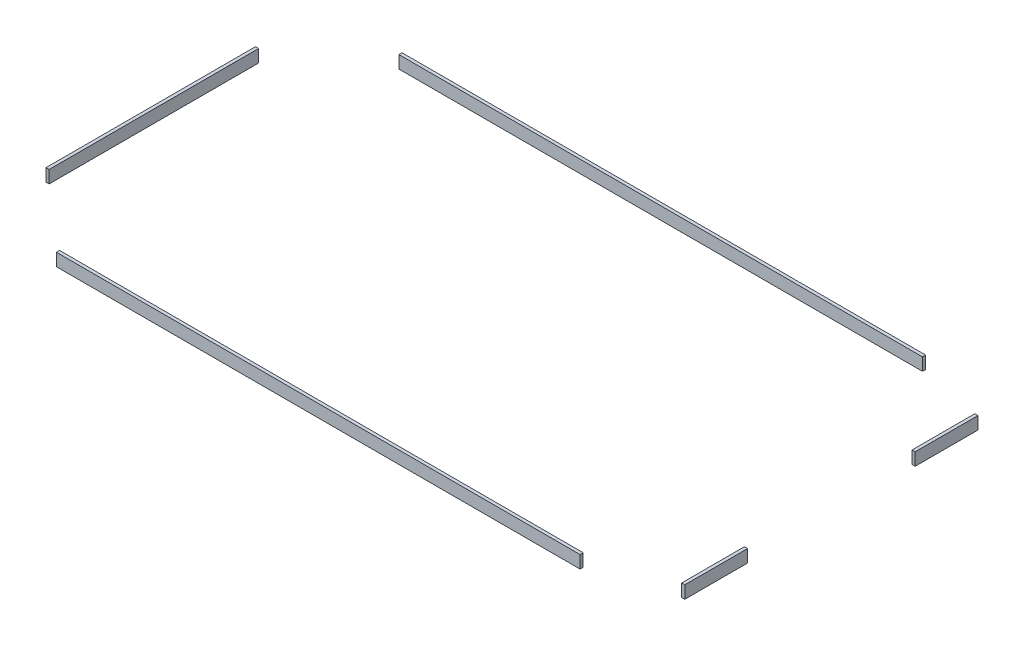
ISO-10303-21;
HEADER;
FILE_DESCRIPTION(('STEP AP214'),'2;1');
FILE_NAME('part.step','',(''),(''),'','','');
FILE_SCHEMA(('AUTOMOTIVE_DESIGN { 1 0 10303 214 1 1 1 1 }'));
ENDSEC;
DATA;
#1=APPLICATION_CONTEXT('core data for automotive mechanical design processes');
#2=APPLICATION_PROTOCOL_DEFINITION('international standard','automotive_design',2000,#1);
#3=PRODUCT_CONTEXT('',#1,'mechanical');
#4=PRODUCT('Part','Part','',(#3));
#5=PRODUCT_RELATED_PRODUCT_CATEGORY('part','',(#4));
#6=PRODUCT_DEFINITION_FORMATION('','',#4);
#7=PRODUCT_DEFINITION_CONTEXT('part definition',#1,'design');
#8=PRODUCT_DEFINITION('design','',#6,#7);
#9=PRODUCT_DEFINITION_SHAPE('','',#8);
#10=(LENGTH_UNIT() NAMED_UNIT(*) SI_UNIT(.MILLI.,.METRE.));
#11=(NAMED_UNIT(*) PLANE_ANGLE_UNIT() SI_UNIT($,.RADIAN.));
#12=(NAMED_UNIT(*) SI_UNIT($,.STERADIAN.) SOLID_ANGLE_UNIT());
#13=UNCERTAINTY_MEASURE_WITH_UNIT(LENGTH_MEASURE(1.E-05),#10,'distance_accuracy_value','');
#14=(GEOMETRIC_REPRESENTATION_CONTEXT(3) GLOBAL_UNCERTAINTY_ASSIGNED_CONTEXT((#13)) GLOBAL_UNIT_ASSIGNED_CONTEXT((#10,
#11,#12)) REPRESENTATION_CONTEXT('',''));
#15=CARTESIAN_POINT('',(0.,0.,0.));
#16=DIRECTION('',(0.,0.,1.));
#17=DIRECTION('',(1.,0.,0.));
#18=AXIS2_PLACEMENT_3D('',#15,#16,#17);
#19=CARTESIAN_POINT('',(162.5,-3.,-81.75));
#20=DIRECTION('',(0.,1.,0.));
#21=DIRECTION('',(-1.,0.,0.));
#22=AXIS2_PLACEMENT_3D('',#19,#20,#21);
#23=PLANE('',#22);
#24=DIRECTION('',(0.,0.,1.));
#25=VECTOR('',#24,1.);
#26=CARTESIAN_POINT('',(161.,-3.,-81.75));
#27=LINE('',#26,#25);
#28=CARTESIAN_POINT('',(161.,-3.,-70.));
#29=VERTEX_POINT('',#28);
#30=CARTESIAN_POINT('',(161.,-3.,-40.));
#31=VERTEX_POINT('',#30);
#32=EDGE_CURVE('E115',#29,#31,#27,.T.);
#33=ORIENTED_EDGE('',*,*,#32,.F.);
#34=DIRECTION('',(1.,0.,0.));
#35=VECTOR('',#34,1.);
#36=CARTESIAN_POINT('',(217.543604288316,-3.,-70.));
#37=LINE('',#36,#35);
#38=CARTESIAN_POINT('',(162.5,-3.,-70.));
#39=VERTEX_POINT('',#38);
#40=EDGE_CURVE('E131',#29,#39,#37,.T.);
#41=ORIENTED_EDGE('',*,*,#40,.T.);
#42=DIRECTION('',(0.,0.,1.));
#43=VECTOR('',#42,1.);
#44=CARTESIAN_POINT('',(162.5,-3.,-81.75));
#45=LINE('',#44,#43);
#46=CARTESIAN_POINT('',(162.5,-3.,-40.));
#47=VERTEX_POINT('',#46);
#48=EDGE_CURVE('E65',#39,#47,#45,.T.);
#49=ORIENTED_EDGE('',*,*,#48,.T.);
#50=DIRECTION('',(-1.,0.,0.));
#51=VECTOR('',#50,1.);
#52=CARTESIAN_POINT('',(127.175720913228,-3.,-40.));
#53=LINE('',#52,#51);
#54=EDGE_CURVE('E126',#47,#31,#53,.T.);
#55=ORIENTED_EDGE('',*,*,#54,.T.);
#56=EDGE_LOOP('',(#33,#41,#49,#55));
#57=FACE_BOUND('',#56,.T.);
#58=ADVANCED_FACE('F62',(#57),#23,.F.);
#59=CARTESIAN_POINT('',(162.5,-3.,-81.75));
#60=DIRECTION('',(-1.,0.,0.));
#61=DIRECTION('',(0.,0.,1.));
#62=AXIS2_PLACEMENT_3D('',#59,#60,#61);
#63=PLANE('',#62);
#64=ORIENTED_EDGE('',*,*,#48,.F.);
#65=DIRECTION('',(0.,1.,0.));
#66=VECTOR('',#65,1.);
#67=CARTESIAN_POINT('',(162.5,-3.,-70.));
#68=LINE('',#67,#66);
#69=CARTESIAN_POINT('',(162.5,3.,-70.));
#70=VERTEX_POINT('',#69);
#71=EDGE_CURVE('E79',#39,#70,#68,.T.);
#72=ORIENTED_EDGE('',*,*,#71,.T.);
#73=DIRECTION('',(0.,0.,1.));
#74=VECTOR('',#73,1.);
#75=CARTESIAN_POINT('',(162.5,3.,-81.75));
#76=LINE('',#75,#74);
#77=CARTESIAN_POINT('',(162.5,3.,-40.));
#78=VERTEX_POINT('',#77);
#79=EDGE_CURVE('E122',#70,#78,#76,.T.);
#80=ORIENTED_EDGE('',*,*,#79,.T.);
#81=DIRECTION('',(0.,-1.,0.));
#82=VECTOR('',#81,1.);
#83=CARTESIAN_POINT('',(162.5,-3.,-40.));
#84=LINE('',#83,#82);
#85=EDGE_CURVE('E102',#78,#47,#84,.T.);
#86=ORIENTED_EDGE('',*,*,#85,.T.);
#87=EDGE_LOOP('',(#64,#72,#80,#86));
#88=FACE_BOUND('',#87,.T.);
#89=ADVANCED_FACE('F134',(#88),#63,.F.);
#90=CARTESIAN_POINT('',(161.,3.,-81.75));
#91=DIRECTION('',(0.,-1.,0.));
#92=DIRECTION('',(0.,0.,-1.));
#93=AXIS2_PLACEMENT_3D('',#90,#91,#92);
#94=PLANE('',#93);
#95=ORIENTED_EDGE('',*,*,#79,.F.);
#96=DIRECTION('',(1.,0.,0.));
#97=VECTOR('',#96,1.);
#98=CARTESIAN_POINT('',(217.543604288316,3.,-70.));
#99=LINE('',#98,#97);
#100=CARTESIAN_POINT('',(161.,3.,-70.));
#101=VERTEX_POINT('',#100);
#102=EDGE_CURVE('E13',#101,#70,#99,.T.);
#103=ORIENTED_EDGE('',*,*,#102,.F.);
#104=DIRECTION('',(0.,0.,1.));
#105=VECTOR('',#104,1.);
#106=CARTESIAN_POINT('',(161.,3.,-81.75));
#107=LINE('',#106,#105);
#108=CARTESIAN_POINT('',(161.,3.,-40.));
#109=VERTEX_POINT('',#108);
#110=EDGE_CURVE('E113',#101,#109,#107,.T.);
#111=ORIENTED_EDGE('',*,*,#110,.T.);
#112=DIRECTION('',(-1.,0.,0.));
#113=VECTOR('',#112,1.);
#114=CARTESIAN_POINT('',(127.175720913228,3.,-40.));
#115=LINE('',#114,#113);
#116=EDGE_CURVE('E71',#78,#109,#115,.T.);
#117=ORIENTED_EDGE('',*,*,#116,.F.);
#118=EDGE_LOOP('',(#95,#103,#111,#117));
#119=FACE_BOUND('',#118,.T.);
#120=ADVANCED_FACE('F118',(#119),#94,.F.);
#121=CARTESIAN_POINT('',(161.,3.,-81.75));
#122=DIRECTION('',(1.,0.,0.));
#123=DIRECTION('',(0.,0.,-1.));
#124=AXIS2_PLACEMENT_3D('',#121,#122,#123);
#125=PLANE('',#124);
#126=ORIENTED_EDGE('',*,*,#110,.F.);
#127=DIRECTION('',(0.,-1.,0.));
#128=VECTOR('',#127,1.);
#129=CARTESIAN_POINT('',(161.,3.,-70.));
#130=LINE('',#129,#128);
#131=EDGE_CURVE('E119',#101,#29,#130,.T.);
#132=ORIENTED_EDGE('',*,*,#131,.T.);
#133=ORIENTED_EDGE('',*,*,#32,.T.);
#134=DIRECTION('',(0.,1.,0.));
#135=VECTOR('',#134,1.);
#136=CARTESIAN_POINT('',(161.,3.,-40.));
#137=LINE('',#136,#135);
#138=EDGE_CURVE('E99',#31,#109,#137,.T.);
#139=ORIENTED_EDGE('',*,*,#138,.T.);
#140=EDGE_LOOP('',(#126,#132,#133,#139));
#141=FACE_BOUND('',#140,.T.);
#142=ADVANCED_FACE('F111',(#141),#125,.F.);
#143=CARTESIAN_POINT('',(127.175720913228,-3.,-40.));
#144=DIRECTION('',(0.,0.,-1.));
#145=DIRECTION('',(-1.,0.,0.));
#146=AXIS2_PLACEMENT_3D('',#143,#144,#145);
#147=PLANE('',#146);
#148=ORIENTED_EDGE('',*,*,#116,.T.);
#149=ORIENTED_EDGE('',*,*,#138,.F.);
#150=ORIENTED_EDGE('',*,*,#54,.F.);
#151=ORIENTED_EDGE('',*,*,#85,.F.);
#152=EDGE_LOOP('',(#148,#149,#150,#151));
#153=FACE_BOUND('',#152,.T.);
#154=ADVANCED_FACE('F98',(#153),#147,.F.);
#155=CARTESIAN_POINT('',(217.543604288316,-3.,-70.));
#156=DIRECTION('',(0.,0.,1.));
#157=DIRECTION('',(1.,0.,0.));
#158=AXIS2_PLACEMENT_3D('',#155,#156,#157);
#159=PLANE('',#158);
#160=ORIENTED_EDGE('',*,*,#40,.F.);
#161=ORIENTED_EDGE('',*,*,#131,.F.);
#162=ORIENTED_EDGE('',*,*,#102,.T.);
#163=ORIENTED_EDGE('',*,*,#71,.F.);
#164=EDGE_LOOP('',(#160,#161,#162,#163));
#165=FACE_BOUND('',#164,.T.);
#166=ADVANCED_FACE('F144',(#165),#159,.F.);
#167=CLOSED_SHELL('',(#58,#89,#120,#142,#154,#166));
#168=MANIFOLD_SOLID_BREP('B2',#167);
#169=CARTESIAN_POINT('',(-161.75,3.,-81.));
#170=DIRECTION('',(0.,0.,-1.));
#171=DIRECTION('',(-1.,0.,0.));
#172=AXIS2_PLACEMENT_3D('',#169,#170,#171);
#173=PLANE('',#172);
#174=DIRECTION('',(1.,0.,0.));
#175=VECTOR('',#174,1.);
#176=CARTESIAN_POINT('',(-161.75,3.,-81.));
#177=LINE('',#176,#175);
#178=CARTESIAN_POINT('',(-125.,3.,-80.9999999999998));
#179=VERTEX_POINT('',#178);
#180=CARTESIAN_POINT('',(125.,3.,-80.9999999999998));
#181=VERTEX_POINT('',#180);
#182=EDGE_CURVE('E260',#179,#181,#177,.T.);
#183=ORIENTED_EDGE('',*,*,#182,.F.);
#184=DIRECTION('',(0.,-1.,0.));
#185=VECTOR('',#184,1.);
#186=CARTESIAN_POINT('',(-125.,3.,-81.));
#187=LINE('',#186,#185);
#188=CARTESIAN_POINT('',(-125.,-3.,-80.9999999999998));
#189=VERTEX_POINT('',#188);
#190=EDGE_CURVE('E265',#179,#189,#187,.T.);
#191=ORIENTED_EDGE('',*,*,#190,.T.);
#192=DIRECTION('',(1.,0.,0.));
#193=VECTOR('',#192,1.);
#194=CARTESIAN_POINT('',(-161.75,-3.,-81.));
#195=LINE('',#194,#193);
#196=CARTESIAN_POINT('',(125.,-3.,-81.));
#197=VERTEX_POINT('',#196);
#198=EDGE_CURVE('E207',#189,#197,#195,.T.);
#199=ORIENTED_EDGE('',*,*,#198,.T.);
#200=DIRECTION('',(0.,1.,0.));
#201=VECTOR('',#200,1.);
#202=CARTESIAN_POINT('',(125.,3.,-81.));
#203=LINE('',#202,#201);
#204=EDGE_CURVE('E228',#197,#181,#203,.T.);
#205=ORIENTED_EDGE('',*,*,#204,.T.);
#206=EDGE_LOOP('',(#183,#191,#199,#205));
#207=FACE_BOUND('',#206,.T.);
#208=ADVANCED_FACE('F204',(#207),#173,.F.);
#209=CARTESIAN_POINT('',(-161.75,3.,-81.));
#210=DIRECTION('',(0.,-1.,0.));
#211=DIRECTION('',(0.,0.,-1.));
#212=AXIS2_PLACEMENT_3D('',#209,#210,#211);
#213=PLANE('',#212);
#214=DIRECTION('',(1.,0.,0.));
#215=VECTOR('',#214,1.);
#216=CARTESIAN_POINT('',(-161.75,3.,-82.5));
#217=LINE('',#216,#215);
#218=CARTESIAN_POINT('',(-125.,3.,-82.5));
#219=VERTEX_POINT('',#218);
#220=CARTESIAN_POINT('',(125.,3.,-82.5));
#221=VERTEX_POINT('',#220);
#222=EDGE_CURVE('E212',#219,#221,#217,.T.);
#223=ORIENTED_EDGE('',*,*,#222,.F.);
#224=DIRECTION('',(0.,0.,-1.));
#225=VECTOR('',#224,1.);
#226=CARTESIAN_POINT('',(-125.,3.,-90.));
#227=LINE('',#226,#225);
#228=EDGE_CURVE('E270',#179,#219,#227,.T.);
#229=ORIENTED_EDGE('',*,*,#228,.F.);
#230=ORIENTED_EDGE('',*,*,#182,.T.);
#231=DIRECTION('',(0.,0.,1.));
#232=VECTOR('',#231,1.);
#233=CARTESIAN_POINT('',(125.,3.,-100.493794054243));
#234=LINE('',#233,#232);
#235=EDGE_CURVE('E247',#221,#181,#234,.T.);
#236=ORIENTED_EDGE('',*,*,#235,.F.);
#237=EDGE_LOOP('',(#223,#229,#230,#236));
#238=FACE_BOUND('',#237,.T.);
#239=ADVANCED_FACE('F257',(#238),#213,.F.);
#240=CARTESIAN_POINT('',(-161.75,-3.,-82.5));
#241=DIRECTION('',(0.,0.,1.));
#242=DIRECTION('',(1.,0.,0.));
#243=AXIS2_PLACEMENT_3D('',#240,#241,#242);
#244=PLANE('',#243);
#245=DIRECTION('',(1.,0.,0.));
#246=VECTOR('',#245,1.);
#247=CARTESIAN_POINT('',(-161.75,-3.,-82.5));
#248=LINE('',#247,#246);
#249=CARTESIAN_POINT('',(-125.,-3.,-82.5));
#250=VERTEX_POINT('',#249);
#251=CARTESIAN_POINT('',(125.,-3.,-82.5));
#252=VERTEX_POINT('',#251);
#253=EDGE_CURVE('E60',#250,#252,#248,.T.);
#254=ORIENTED_EDGE('',*,*,#253,.F.);
#255=DIRECTION('',(0.,1.,0.));
#256=VECTOR('',#255,1.);
#257=CARTESIAN_POINT('',(-125.,-3.,-82.5));
#258=LINE('',#257,#256);
#259=EDGE_CURVE('E220',#250,#219,#258,.T.);
#260=ORIENTED_EDGE('',*,*,#259,.T.);
#261=ORIENTED_EDGE('',*,*,#222,.T.);
#262=DIRECTION('',(0.,-1.,0.));
#263=VECTOR('',#262,1.);
#264=CARTESIAN_POINT('',(125.,-3.,-82.5));
#265=LINE('',#264,#263);
#266=EDGE_CURVE('E244',#221,#252,#265,.T.);
#267=ORIENTED_EDGE('',*,*,#266,.T.);
#268=EDGE_LOOP('',(#254,#260,#261,#267));
#269=FACE_BOUND('',#268,.T.);
#270=ADVANCED_FACE('F262',(#269),#244,.F.);
#271=CARTESIAN_POINT('',(-161.75,-3.,-82.5));
#272=DIRECTION('',(0.,1.,0.));
#273=DIRECTION('',(0.,0.,1.));
#274=AXIS2_PLACEMENT_3D('',#271,#272,#273);
#275=PLANE('',#274);
#276=ORIENTED_EDGE('',*,*,#198,.F.);
#277=DIRECTION('',(0.,0.,-1.));
#278=VECTOR('',#277,1.);
#279=CARTESIAN_POINT('',(-125.,-3.,-90.));
#280=LINE('',#279,#278);
#281=EDGE_CURVE('E252',#189,#250,#280,.T.);
#282=ORIENTED_EDGE('',*,*,#281,.T.);
#283=ORIENTED_EDGE('',*,*,#253,.T.);
#284=DIRECTION('',(0.,0.,1.));
#285=VECTOR('',#284,1.);
#286=CARTESIAN_POINT('',(125.,-3.,-100.493794054243));
#287=LINE('',#286,#285);
#288=EDGE_CURVE('E248',#252,#197,#287,.T.);
#289=ORIENTED_EDGE('',*,*,#288,.T.);
#290=EDGE_LOOP('',(#276,#282,#283,#289));
#291=FACE_BOUND('',#290,.T.);
#292=ADVANCED_FACE('F278',(#291),#275,.F.);
#293=CARTESIAN_POINT('',(125.,-3.,-100.493794054243));
#294=DIRECTION('',(-1.,0.,0.));
#295=DIRECTION('',(0.,0.,1.));
#296=AXIS2_PLACEMENT_3D('',#293,#294,#295);
#297=PLANE('',#296);
#298=ORIENTED_EDGE('',*,*,#288,.F.);
#299=ORIENTED_EDGE('',*,*,#266,.F.);
#300=ORIENTED_EDGE('',*,*,#235,.T.);
#301=ORIENTED_EDGE('',*,*,#204,.F.);
#302=EDGE_LOOP('',(#298,#299,#300,#301));
#303=FACE_BOUND('',#302,.T.);
#304=ADVANCED_FACE('F246',(#303),#297,.F.);
#305=CARTESIAN_POINT('',(-125.,-3.,-90.));
#306=DIRECTION('',(1.,0.,0.));
#307=DIRECTION('',(0.,0.,-1.));
#308=AXIS2_PLACEMENT_3D('',#305,#306,#307);
#309=PLANE('',#308);
#310=ORIENTED_EDGE('',*,*,#228,.T.);
#311=ORIENTED_EDGE('',*,*,#259,.F.);
#312=ORIENTED_EDGE('',*,*,#281,.F.);
#313=ORIENTED_EDGE('',*,*,#190,.F.);
#314=EDGE_LOOP('',(#310,#311,#312,#313));
#315=FACE_BOUND('',#314,.T.);
#316=ADVANCED_FACE('F273',(#315),#309,.F.);
#317=CLOSED_SHELL('',(#208,#239,#270,#292,#304,#316));
#318=MANIFOLD_SOLID_BREP('B7',#317);
#319=CARTESIAN_POINT('',(161.,3.,-81.75));
#320=DIRECTION('',(1.,0.,0.));
#321=DIRECTION('',(0.,0.,-1.));
#322=AXIS2_PLACEMENT_3D('',#319,#320,#321);
#323=PLANE('',#322);
#324=DIRECTION('',(0.,0.,1.));
#325=VECTOR('',#324,1.);
#326=CARTESIAN_POINT('',(161.,3.,-81.75));
#327=LINE('',#326,#325);
#328=CARTESIAN_POINT('',(161.,3.,40.));
#329=VERTEX_POINT('',#328);
#330=CARTESIAN_POINT('',(161.,3.,70.));
#331=VERTEX_POINT('',#330);
#332=EDGE_CURVE('E401',#329,#331,#327,.T.);
#333=ORIENTED_EDGE('',*,*,#332,.F.);
#334=DIRECTION('',(0.,-1.,0.));
#335=VECTOR('',#334,1.);
#336=CARTESIAN_POINT('',(161.,3.,40.));
#337=LINE('',#336,#335);
#338=CARTESIAN_POINT('',(161.,-3.,40.));
#339=VERTEX_POINT('',#338);
#340=EDGE_CURVE('E202',#329,#339,#337,.T.);
#341=ORIENTED_EDGE('',*,*,#340,.T.);
#342=DIRECTION('',(0.,0.,1.));
#343=VECTOR('',#342,1.);
#344=CARTESIAN_POINT('',(161.,-3.,-81.75));
#345=LINE('',#344,#343);
#346=CARTESIAN_POINT('',(161.,-3.,70.));
#347=VERTEX_POINT('',#346);
#348=EDGE_CURVE('E407',#339,#347,#345,.T.);
#349=ORIENTED_EDGE('',*,*,#348,.T.);
#350=DIRECTION('',(0.,1.,0.));
#351=VECTOR('',#350,1.);
#352=CARTESIAN_POINT('',(161.,3.,70.));
#353=LINE('',#352,#351);
#354=EDGE_CURVE('E354',#347,#331,#353,.T.);
#355=ORIENTED_EDGE('',*,*,#354,.T.);
#356=EDGE_LOOP('',(#333,#341,#349,#355));
#357=FACE_BOUND('',#356,.T.);
#358=ADVANCED_FACE('F346',(#357),#323,.F.);
#359=CARTESIAN_POINT('',(161.,3.,-81.75));
#360=DIRECTION('',(0.,-1.,0.));
#361=DIRECTION('',(0.,0.,-1.));
#362=AXIS2_PLACEMENT_3D('',#359,#360,#361);
#363=PLANE('',#362);
#364=DIRECTION('',(0.,0.,1.));
#365=VECTOR('',#364,1.);
#366=CARTESIAN_POINT('',(162.5,3.,-81.75));
#367=LINE('',#366,#365);
#368=CARTESIAN_POINT('',(162.5,3.,40.));
#369=VERTEX_POINT('',#368);
#370=CARTESIAN_POINT('',(162.5,3.,70.));
#371=VERTEX_POINT('',#370);
#372=EDGE_CURVE('E399',#369,#371,#367,.T.);
#373=ORIENTED_EDGE('',*,*,#372,.F.);
#374=DIRECTION('',(1.,0.,0.));
#375=VECTOR('',#374,1.);
#376=CARTESIAN_POINT('',(127.175720913228,3.,40.));
#377=LINE('',#376,#375);
#378=EDGE_CURVE('E416',#329,#369,#377,.T.);
#379=ORIENTED_EDGE('',*,*,#378,.F.);
#380=ORIENTED_EDGE('',*,*,#332,.T.);
#381=DIRECTION('',(-1.,0.,0.));
#382=VECTOR('',#381,1.);
#383=CARTESIAN_POINT('',(217.543604288316,3.,70.));
#384=LINE('',#383,#382);
#385=EDGE_CURVE('E361',#371,#331,#384,.T.);
#386=ORIENTED_EDGE('',*,*,#385,.F.);
#387=EDGE_LOOP('',(#373,#379,#380,#386));
#388=FACE_BOUND('',#387,.T.);
#389=ADVANCED_FACE('F397',(#388),#363,.F.);
#390=CARTESIAN_POINT('',(162.5,-3.,-81.75));
#391=DIRECTION('',(-1.,0.,0.));
#392=DIRECTION('',(0.,0.,1.));
#393=AXIS2_PLACEMENT_3D('',#390,#391,#392);
#394=PLANE('',#393);
#395=DIRECTION('',(0.,0.,1.));
#396=VECTOR('',#395,1.);
#397=CARTESIAN_POINT('',(162.5,-3.,-81.75));
#398=LINE('',#397,#396);
#399=CARTESIAN_POINT('',(162.5,-3.,40.));
#400=VERTEX_POINT('',#399);
#401=CARTESIAN_POINT('',(162.5,-3.,70.));
#402=VERTEX_POINT('',#401);
#403=EDGE_CURVE('E405',#400,#402,#398,.T.);
#404=ORIENTED_EDGE('',*,*,#403,.F.);
#405=DIRECTION('',(0.,1.,0.));
#406=VECTOR('',#405,1.);
#407=CARTESIAN_POINT('',(162.5,-3.,40.));
#408=LINE('',#407,#406);
#409=EDGE_CURVE('E392',#400,#369,#408,.T.);
#410=ORIENTED_EDGE('',*,*,#409,.T.);
#411=ORIENTED_EDGE('',*,*,#372,.T.);
#412=DIRECTION('',(0.,-1.,0.));
#413=VECTOR('',#412,1.);
#414=CARTESIAN_POINT('',(162.5,-3.,70.));
#415=LINE('',#414,#413);
#416=EDGE_CURVE('E384',#371,#402,#415,.T.);
#417=ORIENTED_EDGE('',*,*,#416,.T.);
#418=EDGE_LOOP('',(#404,#410,#411,#417));
#419=FACE_BOUND('',#418,.T.);
#420=ADVANCED_FACE('F404',(#419),#394,.F.);
#421=CARTESIAN_POINT('',(162.5,-3.,-81.75));
#422=DIRECTION('',(0.,1.,0.));
#423=DIRECTION('',(-1.,0.,0.));
#424=AXIS2_PLACEMENT_3D('',#421,#422,#423);
#425=PLANE('',#424);
#426=ORIENTED_EDGE('',*,*,#348,.F.);
#427=DIRECTION('',(1.,0.,0.));
#428=VECTOR('',#427,1.);
#429=CARTESIAN_POINT('',(127.175720913228,-3.,40.));
#430=LINE('',#429,#428);
#431=EDGE_CURVE('E369',#339,#400,#430,.T.);
#432=ORIENTED_EDGE('',*,*,#431,.T.);
#433=ORIENTED_EDGE('',*,*,#403,.T.);
#434=DIRECTION('',(-1.,0.,0.));
#435=VECTOR('',#434,1.);
#436=CARTESIAN_POINT('',(217.543604288316,-3.,70.));
#437=LINE('',#436,#435);
#438=EDGE_CURVE('E387',#402,#347,#437,.T.);
#439=ORIENTED_EDGE('',*,*,#438,.T.);
#440=EDGE_LOOP('',(#426,#432,#433,#439));
#441=FACE_BOUND('',#440,.T.);
#442=ADVANCED_FACE('F348',(#441),#425,.F.);
#443=CARTESIAN_POINT('',(217.543604288316,-3.,70.));
#444=DIRECTION('',(0.,0.,-1.));
#445=DIRECTION('',(-1.,0.,0.));
#446=AXIS2_PLACEMENT_3D('',#443,#444,#445);
#447=PLANE('',#446);
#448=ORIENTED_EDGE('',*,*,#385,.T.);
#449=ORIENTED_EDGE('',*,*,#354,.F.);
#450=ORIENTED_EDGE('',*,*,#438,.F.);
#451=ORIENTED_EDGE('',*,*,#416,.F.);
#452=EDGE_LOOP('',(#448,#449,#450,#451));
#453=FACE_BOUND('',#452,.T.);
#454=ADVANCED_FACE('F385',(#453),#447,.F.);
#455=CARTESIAN_POINT('',(127.175720913228,-3.,40.));
#456=DIRECTION('',(0.,0.,1.));
#457=DIRECTION('',(1.,0.,0.));
#458=AXIS2_PLACEMENT_3D('',#455,#456,#457);
#459=PLANE('',#458);
#460=ORIENTED_EDGE('',*,*,#431,.F.);
#461=ORIENTED_EDGE('',*,*,#340,.F.);
#462=ORIENTED_EDGE('',*,*,#378,.T.);
#463=ORIENTED_EDGE('',*,*,#409,.F.);
#464=EDGE_LOOP('',(#460,#461,#462,#463));
#465=FACE_BOUND('',#464,.T.);
#466=ADVANCED_FACE('F420',(#465),#459,.F.);
#467=CLOSED_SHELL('',(#358,#389,#420,#442,#454,#466));
#468=MANIFOLD_SOLID_BREP('B54',#467);
#469=CARTESIAN_POINT('',(-161.,-3.,-81.75));
#470=DIRECTION('',(0.,1.,0.));
#471=DIRECTION('',(-1.,0.,0.));
#472=AXIS2_PLACEMENT_3D('',#469,#470,#471);
#473=PLANE('',#472);
#474=DIRECTION('',(0.,0.,1.));
#475=VECTOR('',#474,1.);
#476=CARTESIAN_POINT('',(-162.5,-3.,-81.75));
#477=LINE('',#476,#475);
#478=CARTESIAN_POINT('',(-162.5,-3.,-50.));
#479=VERTEX_POINT('',#478);
#480=CARTESIAN_POINT('',(-162.5,-3.,50.));
#481=VERTEX_POINT('',#480);
#482=EDGE_CURVE('E540',#479,#481,#477,.T.);
#483=ORIENTED_EDGE('',*,*,#482,.F.);
#484=DIRECTION('',(1.,0.,0.));
#485=VECTOR('',#484,1.);
#486=CARTESIAN_POINT('',(-165.,-3.,-50.));
#487=LINE('',#486,#485);
#488=CARTESIAN_POINT('',(-161.,-3.,-50.));
#489=VERTEX_POINT('',#488);
#490=EDGE_CURVE('E508',#479,#489,#487,.T.);
#491=ORIENTED_EDGE('',*,*,#490,.T.);
#492=DIRECTION('',(0.,0.,1.));
#493=VECTOR('',#492,1.);
#494=CARTESIAN_POINT('',(-161.,-3.,-81.75));
#495=LINE('',#494,#493);
#496=CARTESIAN_POINT('',(-161.,-3.,50.));
#497=VERTEX_POINT('',#496);
#498=EDGE_CURVE('E543',#489,#497,#495,.T.);
#499=ORIENTED_EDGE('',*,*,#498,.T.);
#500=DIRECTION('',(-1.,0.,0.));
#501=VECTOR('',#500,1.);
#502=CARTESIAN_POINT('',(-165.,-3.,50.));
#503=LINE('',#502,#501);
#504=EDGE_CURVE('E537',#497,#481,#503,.T.);
#505=ORIENTED_EDGE('',*,*,#504,.T.);
#506=EDGE_LOOP('',(#483,#491,#499,#505));
#507=FACE_BOUND('',#506,.T.);
#508=ADVANCED_FACE('F486',(#507),#473,.F.);
#509=CARTESIAN_POINT('',(-161.,-3.,-81.75));
#510=DIRECTION('',(-1.,0.,0.));
#511=DIRECTION('',(0.,0.,1.));
#512=AXIS2_PLACEMENT_3D('',#509,#510,#511);
#513=PLANE('',#512);
#514=ORIENTED_EDGE('',*,*,#498,.F.);
#515=DIRECTION('',(0.,1.,0.));
#516=VECTOR('',#515,1.);
#517=CARTESIAN_POINT('',(-161.,-3.,-50.));
#518=LINE('',#517,#516);
#519=CARTESIAN_POINT('',(-161.,3.,-50.));
#520=VERTEX_POINT('',#519);
#521=EDGE_CURVE('E546',#489,#520,#518,.T.);
#522=ORIENTED_EDGE('',*,*,#521,.T.);
#523=DIRECTION('',(0.,0.,1.));
#524=VECTOR('',#523,1.);
#525=CARTESIAN_POINT('',(-161.,3.,-81.75));
#526=LINE('',#525,#524);
#527=CARTESIAN_POINT('',(-161.,3.,50.));
#528=VERTEX_POINT('',#527);
#529=EDGE_CURVE('E536',#520,#528,#526,.T.);
#530=ORIENTED_EDGE('',*,*,#529,.T.);
#531=DIRECTION('',(0.,-1.,0.));
#532=VECTOR('',#531,1.);
#533=CARTESIAN_POINT('',(-161.,-3.,50.));
#534=LINE('',#533,#532);
#535=EDGE_CURVE('E553',#528,#497,#534,.T.);
#536=ORIENTED_EDGE('',*,*,#535,.T.);
#537=EDGE_LOOP('',(#514,#522,#530,#536));
#538=FACE_BOUND('',#537,.T.);
#539=ADVANCED_FACE('F560',(#538),#513,.F.);
#540=CARTESIAN_POINT('',(-162.5,3.,-81.75));
#541=DIRECTION('',(0.,-1.,0.));
#542=DIRECTION('',(0.,0.,-1.));
#543=AXIS2_PLACEMENT_3D('',#540,#541,#542);
#544=PLANE('',#543);
#545=ORIENTED_EDGE('',*,*,#529,.F.);
#546=DIRECTION('',(1.,0.,0.));
#547=VECTOR('',#546,1.);
#548=CARTESIAN_POINT('',(-165.,3.,-50.));
#549=LINE('',#548,#547);
#550=CARTESIAN_POINT('',(-162.5,3.,-50.));
#551=VERTEX_POINT('',#550);
#552=EDGE_CURVE('E524',#551,#520,#549,.T.);
#553=ORIENTED_EDGE('',*,*,#552,.F.);
#554=DIRECTION('',(0.,0.,1.));
#555=VECTOR('',#554,1.);
#556=CARTESIAN_POINT('',(-162.5,3.,-81.75));
#557=LINE('',#556,#555);
#558=CARTESIAN_POINT('',(-162.5,3.,50.));
#559=VERTEX_POINT('',#558);
#560=EDGE_CURVE('E534',#551,#559,#557,.T.);
#561=ORIENTED_EDGE('',*,*,#560,.T.);
#562=DIRECTION('',(-1.,0.,0.));
#563=VECTOR('',#562,1.);
#564=CARTESIAN_POINT('',(-165.,3.,50.));
#565=LINE('',#564,#563);
#566=EDGE_CURVE('E500',#528,#559,#565,.T.);
#567=ORIENTED_EDGE('',*,*,#566,.F.);
#568=EDGE_LOOP('',(#545,#553,#561,#567));
#569=FACE_BOUND('',#568,.T.);
#570=ADVANCED_FACE('F533',(#569),#544,.F.);
#571=CARTESIAN_POINT('',(-162.5,3.,-81.75));
#572=DIRECTION('',(1.,0.,0.));
#573=DIRECTION('',(0.,0.,-1.));
#574=AXIS2_PLACEMENT_3D('',#571,#572,#573);
#575=PLANE('',#574);
#576=ORIENTED_EDGE('',*,*,#560,.F.);
#577=DIRECTION('',(0.,-1.,0.));
#578=VECTOR('',#577,1.);
#579=CARTESIAN_POINT('',(-162.5,3.,-50.));
#580=LINE('',#579,#578);
#581=EDGE_CURVE('E344',#551,#479,#580,.T.);
#582=ORIENTED_EDGE('',*,*,#581,.T.);
#583=ORIENTED_EDGE('',*,*,#482,.T.);
#584=DIRECTION('',(0.,1.,0.));
#585=VECTOR('',#584,1.);
#586=CARTESIAN_POINT('',(-162.5,3.,50.));
#587=LINE('',#586,#585);
#588=EDGE_CURVE('E493',#481,#559,#587,.T.);
#589=ORIENTED_EDGE('',*,*,#588,.T.);
#590=EDGE_LOOP('',(#576,#582,#583,#589));
#591=FACE_BOUND('',#590,.T.);
#592=ADVANCED_FACE('F539',(#591),#575,.F.);
#593=CARTESIAN_POINT('',(-165.,-3.,50.));
#594=DIRECTION('',(0.,0.,-1.));
#595=DIRECTION('',(-1.,0.,0.));
#596=AXIS2_PLACEMENT_3D('',#593,#594,#595);
#597=PLANE('',#596);
#598=ORIENTED_EDGE('',*,*,#566,.T.);
#599=ORIENTED_EDGE('',*,*,#588,.F.);
#600=ORIENTED_EDGE('',*,*,#504,.F.);
#601=ORIENTED_EDGE('',*,*,#535,.F.);
#602=EDGE_LOOP('',(#598,#599,#600,#601));
#603=FACE_BOUND('',#602,.T.);
#604=ADVANCED_FACE('F559',(#603),#597,.F.);
#605=CARTESIAN_POINT('',(-165.,-3.,-50.));
#606=DIRECTION('',(0.,0.,1.));
#607=DIRECTION('',(1.,0.,0.));
#608=AXIS2_PLACEMENT_3D('',#605,#606,#607);
#609=PLANE('',#608);
#610=ORIENTED_EDGE('',*,*,#490,.F.);
#611=ORIENTED_EDGE('',*,*,#581,.F.);
#612=ORIENTED_EDGE('',*,*,#552,.T.);
#613=ORIENTED_EDGE('',*,*,#521,.F.);
#614=EDGE_LOOP('',(#610,#611,#612,#613));
#615=FACE_BOUND('',#614,.T.);
#616=ADVANCED_FACE('F523',(#615),#609,.F.);
#617=CLOSED_SHELL('',(#508,#539,#570,#592,#604,#616));
#618=MANIFOLD_SOLID_BREP('B196',#617);
#619=CARTESIAN_POINT('',(-161.75,3.,82.5));
#620=DIRECTION('',(0.,0.,-1.));
#621=DIRECTION('',(-1.,0.,0.));
#622=AXIS2_PLACEMENT_3D('',#619,#620,#621);
#623=PLANE('',#622);
#624=DIRECTION('',(1.,0.,0.));
#625=VECTOR('',#624,1.);
#626=CARTESIAN_POINT('',(-161.75,3.,82.5));
#627=LINE('',#626,#625);
#628=CARTESIAN_POINT('',(-125.,3.,82.5000000000003));
#629=VERTEX_POINT('',#628);
#630=CARTESIAN_POINT('',(125.,3.,82.5000000000003));
#631=VERTEX_POINT('',#630);
#632=EDGE_CURVE('E674',#629,#631,#627,.T.);
#633=ORIENTED_EDGE('',*,*,#632,.F.);
#634=DIRECTION('',(0.,-1.,0.));
#635=VECTOR('',#634,1.);
#636=CARTESIAN_POINT('',(-125.,3.,82.5));
#637=LINE('',#636,#635);
#638=CARTESIAN_POINT('',(-125.,-3.,82.5000000000003));
#639=VERTEX_POINT('',#638);
#640=EDGE_CURVE('E679',#629,#639,#637,.T.);
#641=ORIENTED_EDGE('',*,*,#640,.T.);
#642=DIRECTION('',(1.,0.,0.));
#643=VECTOR('',#642,1.);
#644=CARTESIAN_POINT('',(-161.75,-3.,82.5));
#645=LINE('',#644,#643);
#646=CARTESIAN_POINT('',(125.,-3.,82.5));
#647=VERTEX_POINT('',#646);
#648=EDGE_CURVE('E621',#639,#647,#645,.T.);
#649=ORIENTED_EDGE('',*,*,#648,.T.);
#650=DIRECTION('',(0.,1.,0.));
#651=VECTOR('',#650,1.);
#652=CARTESIAN_POINT('',(125.,3.,82.5));
#653=LINE('',#652,#651);
#654=EDGE_CURVE('E642',#647,#631,#653,.T.);
#655=ORIENTED_EDGE('',*,*,#654,.T.);
#656=EDGE_LOOP('',(#633,#641,#649,#655));
#657=FACE_BOUND('',#656,.T.);
#658=ADVANCED_FACE('F618',(#657),#623,.F.);
#659=CARTESIAN_POINT('',(-161.75,3.,82.5));
#660=DIRECTION('',(0.,-1.,0.));
#661=DIRECTION('',(0.,0.,-1.));
#662=AXIS2_PLACEMENT_3D('',#659,#660,#661);
#663=PLANE('',#662);
#664=DIRECTION('',(1.,0.,0.));
#665=VECTOR('',#664,1.);
#666=CARTESIAN_POINT('',(-161.75,3.,81.));
#667=LINE('',#666,#665);
#668=CARTESIAN_POINT('',(-125.,3.,81.));
#669=VERTEX_POINT('',#668);
#670=CARTESIAN_POINT('',(125.,3.,81.));
#671=VERTEX_POINT('',#670);
#672=EDGE_CURVE('E626',#669,#671,#667,.T.);
#673=ORIENTED_EDGE('',*,*,#672,.F.);
#674=DIRECTION('',(0.,0.,-1.));
#675=VECTOR('',#674,1.);
#676=CARTESIAN_POINT('',(-125.,3.,90.));
#677=LINE('',#676,#675);
#678=EDGE_CURVE('E684',#629,#669,#677,.T.);
#679=ORIENTED_EDGE('',*,*,#678,.F.);
#680=ORIENTED_EDGE('',*,*,#632,.T.);
#681=DIRECTION('',(0.,0.,1.));
#682=VECTOR('',#681,1.);
#683=CARTESIAN_POINT('',(125.,3.,100.493794054243));
#684=LINE('',#683,#682);
#685=EDGE_CURVE('E661',#671,#631,#684,.T.);
#686=ORIENTED_EDGE('',*,*,#685,.F.);
#687=EDGE_LOOP('',(#673,#679,#680,#686));
#688=FACE_BOUND('',#687,.T.);
#689=ADVANCED_FACE('F671',(#688),#663,.F.);
#690=CARTESIAN_POINT('',(-161.75,-3.,81.));
#691=DIRECTION('',(0.,0.,1.));
#692=DIRECTION('',(1.,0.,0.));
#693=AXIS2_PLACEMENT_3D('',#690,#691,#692);
#694=PLANE('',#693);
#695=DIRECTION('',(1.,0.,0.));
#696=VECTOR('',#695,1.);
#697=CARTESIAN_POINT('',(-161.75,-3.,81.));
#698=LINE('',#697,#696);
#699=CARTESIAN_POINT('',(-125.,-3.,81.));
#700=VERTEX_POINT('',#699);
#701=CARTESIAN_POINT('',(125.,-3.,81.));
#702=VERTEX_POINT('',#701);
#703=EDGE_CURVE('E484',#700,#702,#698,.T.);
#704=ORIENTED_EDGE('',*,*,#703,.F.);
#705=DIRECTION('',(0.,1.,0.));
#706=VECTOR('',#705,1.);
#707=CARTESIAN_POINT('',(-125.,-3.,81.));
#708=LINE('',#707,#706);
#709=EDGE_CURVE('E634',#700,#669,#708,.T.);
#710=ORIENTED_EDGE('',*,*,#709,.T.);
#711=ORIENTED_EDGE('',*,*,#672,.T.);
#712=DIRECTION('',(0.,-1.,0.));
#713=VECTOR('',#712,1.);
#714=CARTESIAN_POINT('',(125.,-3.,81.));
#715=LINE('',#714,#713);
#716=EDGE_CURVE('E658',#671,#702,#715,.T.);
#717=ORIENTED_EDGE('',*,*,#716,.T.);
#718=EDGE_LOOP('',(#704,#710,#711,#717));
#719=FACE_BOUND('',#718,.T.);
#720=ADVANCED_FACE('F676',(#719),#694,.F.);
#721=CARTESIAN_POINT('',(-161.75,-3.,81.));
#722=DIRECTION('',(0.,1.,0.));
#723=DIRECTION('',(0.,0.,1.));
#724=AXIS2_PLACEMENT_3D('',#721,#722,#723);
#725=PLANE('',#724);
#726=ORIENTED_EDGE('',*,*,#648,.F.);
#727=DIRECTION('',(0.,0.,-1.));
#728=VECTOR('',#727,1.);
#729=CARTESIAN_POINT('',(-125.,-3.,90.));
#730=LINE('',#729,#728);
#731=EDGE_CURVE('E666',#639,#700,#730,.T.);
#732=ORIENTED_EDGE('',*,*,#731,.T.);
#733=ORIENTED_EDGE('',*,*,#703,.T.);
#734=DIRECTION('',(0.,0.,1.));
#735=VECTOR('',#734,1.);
#736=CARTESIAN_POINT('',(125.,-3.,100.493794054243));
#737=LINE('',#736,#735);
#738=EDGE_CURVE('E662',#702,#647,#737,.T.);
#739=ORIENTED_EDGE('',*,*,#738,.T.);
#740=EDGE_LOOP('',(#726,#732,#733,#739));
#741=FACE_BOUND('',#740,.T.);
#742=ADVANCED_FACE('F692',(#741),#725,.F.);
#743=CARTESIAN_POINT('',(125.,-3.,100.493794054243));
#744=DIRECTION('',(-1.,0.,0.));
#745=DIRECTION('',(0.,0.,1.));
#746=AXIS2_PLACEMENT_3D('',#743,#744,#745);
#747=PLANE('',#746);
#748=ORIENTED_EDGE('',*,*,#738,.F.);
#749=ORIENTED_EDGE('',*,*,#716,.F.);
#750=ORIENTED_EDGE('',*,*,#685,.T.);
#751=ORIENTED_EDGE('',*,*,#654,.F.);
#752=EDGE_LOOP('',(#748,#749,#750,#751));
#753=FACE_BOUND('',#752,.T.);
#754=ADVANCED_FACE('F660',(#753),#747,.F.);
#755=CARTESIAN_POINT('',(-125.,-3.,90.));
#756=DIRECTION('',(1.,0.,0.));
#757=DIRECTION('',(0.,0.,-1.));
#758=AXIS2_PLACEMENT_3D('',#755,#756,#757);
#759=PLANE('',#758);
#760=ORIENTED_EDGE('',*,*,#678,.T.);
#761=ORIENTED_EDGE('',*,*,#709,.F.);
#762=ORIENTED_EDGE('',*,*,#731,.F.);
#763=ORIENTED_EDGE('',*,*,#640,.F.);
#764=EDGE_LOOP('',(#760,#761,#762,#763));
#765=FACE_BOUND('',#764,.T.);
#766=ADVANCED_FACE('F687',(#765),#759,.F.);
#767=CLOSED_SHELL('',(#658,#689,#720,#742,#754,#766));
#768=MANIFOLD_SOLID_BREP('B338',#767);
#769=ADVANCED_BREP_SHAPE_REPRESENTATION('',(#18,#168,#318,#468,#618,#768),#14);
#770=SHAPE_DEFINITION_REPRESENTATION(#9,#769);
ENDSEC;
END-ISO-10303-21;
